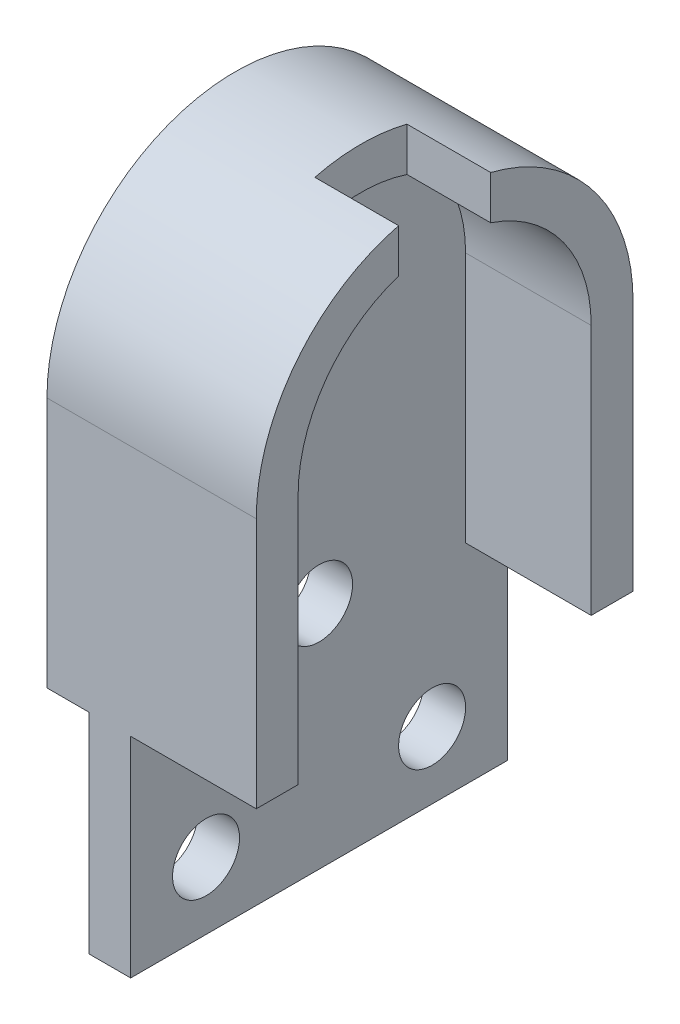
ISO-10303-21;
HEADER;
FILE_DESCRIPTION(('STEP AP214'),'2;1');
FILE_NAME('part.step','',(''),(''),'','','');
FILE_SCHEMA(('AUTOMOTIVE_DESIGN { 1 0 10303 214 1 1 1 1 }'));
ENDSEC;
DATA;
#1=APPLICATION_CONTEXT('core data for automotive mechanical design processes');
#2=APPLICATION_PROTOCOL_DEFINITION('international standard','automotive_design',2000,#1);
#3=PRODUCT_CONTEXT('',#1,'mechanical');
#4=PRODUCT('Part','Part','',(#3));
#5=PRODUCT_RELATED_PRODUCT_CATEGORY('part','',(#4));
#6=PRODUCT_DEFINITION_FORMATION('','',#4);
#7=PRODUCT_DEFINITION_CONTEXT('part definition',#1,'design');
#8=PRODUCT_DEFINITION('design','',#6,#7);
#9=PRODUCT_DEFINITION_SHAPE('','',#8);
#10=(LENGTH_UNIT() NAMED_UNIT(*) SI_UNIT(.MILLI.,.METRE.));
#11=(NAMED_UNIT(*) PLANE_ANGLE_UNIT() SI_UNIT($,.RADIAN.));
#12=(NAMED_UNIT(*) SI_UNIT($,.STERADIAN.) SOLID_ANGLE_UNIT());
#13=UNCERTAINTY_MEASURE_WITH_UNIT(LENGTH_MEASURE(1.E-05),#10,'distance_accuracy_value','');
#14=(GEOMETRIC_REPRESENTATION_CONTEXT(3) GLOBAL_UNCERTAINTY_ASSIGNED_CONTEXT((#13)) GLOBAL_UNIT_ASSIGNED_CONTEXT((#10,
#11,#12)) REPRESENTATION_CONTEXT('',''));
#15=CARTESIAN_POINT('',(0.,0.,0.));
#16=DIRECTION('',(0.,0.,1.));
#17=DIRECTION('',(1.,0.,0.));
#18=AXIS2_PLACEMENT_3D('',#15,#16,#17);
#19=CARTESIAN_POINT('',(20.,0.,0.));
#20=DIRECTION('',(1.,0.,0.));
#21=DIRECTION('',(0.,0.,-1.));
#22=AXIS2_PLACEMENT_3D('',#19,#20,#21);
#23=PLANE('',#22);
#24=DIRECTION('',(0.,1.,0.));
#25=VECTOR('',#24,1.);
#26=CARTESIAN_POINT('',(20.,0.,-5.5));
#27=LINE('',#26,#25);
#28=CARTESIAN_POINT('',(20.,44.1132477258361,-5.5));
#29=VERTEX_POINT('',#28);
#30=CARTESIAN_POINT('',(20.,49.3174242292714,-5.5));
#31=VERTEX_POINT('',#30);
#32=EDGE_CURVE('E43',#29,#31,#27,.T.);
#33=ORIENTED_EDGE('',*,*,#32,.F.);
#34=CARTESIAN_POINT('',(20.,27.5,0.));
#35=DIRECTION('',(1.,0.,0.));
#36=DIRECTION('',(0.,0.,-1.));
#37=AXIS2_PLACEMENT_3D('',#34,#35,#36);
#38=CIRCLE('',#37,17.5);
#39=CARTESIAN_POINT('',(20.,27.5,-17.5));
#40=VERTEX_POINT('',#39);
#41=EDGE_CURVE('E194',#40,#29,#38,.T.);
#42=ORIENTED_EDGE('',*,*,#41,.F.);
#43=DIRECTION('',(0.,-1.,0.));
#44=VECTOR('',#43,1.);
#45=CARTESIAN_POINT('',(20.,0.,-17.5));
#46=LINE('',#45,#44);
#47=CARTESIAN_POINT('',(20.,-2.50000000000001,-17.5));
#48=VERTEX_POINT('',#47);
#49=EDGE_CURVE('E197',#40,#48,#46,.T.);
#50=ORIENTED_EDGE('',*,*,#49,.T.);
#51=DIRECTION('',(0.,0.,-1.));
#52=VECTOR('',#51,1.);
#53=CARTESIAN_POINT('',(20.,-2.50000000000001,0.));
#54=LINE('',#53,#52);
#55=CARTESIAN_POINT('',(20.,-2.50000000000001,-22.5));
#56=VERTEX_POINT('',#55);
#57=EDGE_CURVE('E206',#48,#56,#54,.T.);
#58=ORIENTED_EDGE('',*,*,#57,.T.);
#59=DIRECTION('',(0.,1.,0.));
#60=VECTOR('',#59,1.);
#61=CARTESIAN_POINT('',(20.,0.,-22.5));
#62=LINE('',#61,#60);
#63=CARTESIAN_POINT('',(20.,27.5,-22.5));
#64=VERTEX_POINT('',#63);
#65=EDGE_CURVE('E209',#56,#64,#62,.T.);
#66=ORIENTED_EDGE('',*,*,#65,.T.);
#67=CARTESIAN_POINT('',(20.,27.5,0.));
#68=DIRECTION('',(1.,0.,0.));
#69=DIRECTION('',(0.,0.,-1.));
#70=AXIS2_PLACEMENT_3D('',#67,#68,#69);
#71=CIRCLE('',#70,22.5);
#72=EDGE_CURVE('E213',#64,#31,#71,.T.);
#73=ORIENTED_EDGE('',*,*,#72,.T.);
#74=EDGE_LOOP('',(#33,#42,#50,#58,#66,#73));
#75=FACE_BOUND('',#74,.T.);
#76=ADVANCED_FACE('F35',(#75),#23,.T.);
#77=CARTESIAN_POINT('',(5.,0.,0.));
#78=DIRECTION('',(1.,0.,0.));
#79=DIRECTION('',(0.,0.,-1.));
#80=AXIS2_PLACEMENT_3D('',#77,#78,#79);
#81=PLANE('',#80);
#82=CARTESIAN_POINT('',(5.,0.,0.));
#83=DIRECTION('',(1.,0.,0.));
#84=DIRECTION('',(0.,0.,-1.));
#85=AXIS2_PLACEMENT_3D('',#82,#83,#84);
#86=CIRCLE('',#85,4.);
#87=CARTESIAN_POINT('',(5.,0.,-4.));
#88=VERTEX_POINT('',#87);
#89=EDGE_CURVE('E319',#88,#88,#86,.T.);
#90=ORIENTED_EDGE('',*,*,#89,.F.);
#91=EDGE_LOOP('',(#90));
#92=FACE_BOUND('',#91,.T.);
#93=CARTESIAN_POINT('',(5.,-19.5,-13.5));
#94=DIRECTION('',(1.,0.,0.));
#95=DIRECTION('',(0.,0.,-1.));
#96=AXIS2_PLACEMENT_3D('',#93,#94,#95);
#97=CIRCLE('',#96,4.);
#98=CARTESIAN_POINT('',(5.,-19.5,-17.5));
#99=VERTEX_POINT('',#98);
#100=EDGE_CURVE('E316',#99,#99,#97,.T.);
#101=ORIENTED_EDGE('',*,*,#100,.F.);
#102=EDGE_LOOP('',(#101));
#103=FACE_BOUND('',#102,.T.);
#104=CARTESIAN_POINT('',(5.,-19.5,13.5));
#105=DIRECTION('',(1.,0.,0.));
#106=DIRECTION('',(0.,0.,-1.));
#107=AXIS2_PLACEMENT_3D('',#104,#105,#106);
#108=CIRCLE('',#107,4.);
#109=CARTESIAN_POINT('',(5.,-19.5,9.5));
#110=VERTEX_POINT('',#109);
#111=EDGE_CURVE('E199',#110,#110,#108,.T.);
#112=ORIENTED_EDGE('',*,*,#111,.F.);
#113=EDGE_LOOP('',(#112));
#114=FACE_BOUND('',#113,.T.);
#115=DIRECTION('',(0.,-1.,0.));
#116=VECTOR('',#115,1.);
#117=CARTESIAN_POINT('',(5.,0.,17.5));
#118=LINE('',#117,#116);
#119=CARTESIAN_POINT('',(5.,27.5,17.5));
#120=VERTEX_POINT('',#119);
#121=CARTESIAN_POINT('',(5.,-2.50000000000001,17.5));
#122=VERTEX_POINT('',#121);
#123=EDGE_CURVE('E58',#120,#122,#118,.T.);
#124=ORIENTED_EDGE('',*,*,#123,.T.);
#125=DIRECTION('',(0.,0.,1.));
#126=VECTOR('',#125,1.);
#127=CARTESIAN_POINT('',(5.,-2.50000000000001,0.));
#128=LINE('',#127,#126);
#129=CARTESIAN_POINT('',(5.,-2.50000000000001,22.5));
#130=VERTEX_POINT('',#129);
#131=EDGE_CURVE('E273',#122,#130,#128,.T.);
#132=ORIENTED_EDGE('',*,*,#131,.T.);
#133=DIRECTION('',(0.,1.,0.));
#134=VECTOR('',#133,1.);
#135=CARTESIAN_POINT('',(5.,0.,22.5));
#136=LINE('',#135,#134);
#137=CARTESIAN_POINT('',(5.,-27.5,22.5));
#138=VERTEX_POINT('',#137);
#139=EDGE_CURVE('E281',#138,#130,#136,.T.);
#140=ORIENTED_EDGE('',*,*,#139,.F.);
#141=DIRECTION('',(0.,0.,-1.));
#142=VECTOR('',#141,1.);
#143=CARTESIAN_POINT('',(5.,-27.5,0.));
#144=LINE('',#143,#142);
#145=CARTESIAN_POINT('',(5.,-27.5,-22.5));
#146=VERTEX_POINT('',#145);
#147=EDGE_CURVE('E285',#138,#146,#144,.T.);
#148=ORIENTED_EDGE('',*,*,#147,.T.);
#149=DIRECTION('',(0.,1.,0.));
#150=VECTOR('',#149,1.);
#151=CARTESIAN_POINT('',(5.,0.,-22.5));
#152=LINE('',#151,#150);
#153=CARTESIAN_POINT('',(5.,-2.50000000000001,-22.5));
#154=VERTEX_POINT('',#153);
#155=EDGE_CURVE('E279',#146,#154,#152,.T.);
#156=ORIENTED_EDGE('',*,*,#155,.T.);
#157=DIRECTION('',(0.,0.,-1.));
#158=VECTOR('',#157,1.);
#159=CARTESIAN_POINT('',(5.,-2.50000000000001,0.));
#160=LINE('',#159,#158);
#161=CARTESIAN_POINT('',(5.,-2.50000000000001,-17.5));
#162=VERTEX_POINT('',#161);
#163=EDGE_CURVE('E270',#162,#154,#160,.T.);
#164=ORIENTED_EDGE('',*,*,#163,.F.);
#165=DIRECTION('',(0.,-1.,0.));
#166=VECTOR('',#165,1.);
#167=CARTESIAN_POINT('',(5.,0.,-17.5));
#168=LINE('',#167,#166);
#169=CARTESIAN_POINT('',(5.,27.5,-17.5));
#170=VERTEX_POINT('',#169);
#171=EDGE_CURVE('E249',#170,#162,#168,.T.);
#172=ORIENTED_EDGE('',*,*,#171,.F.);
#173=CARTESIAN_POINT('',(5.,27.5,0.));
#174=DIRECTION('',(1.,0.,0.));
#175=DIRECTION('',(0.,0.,-1.));
#176=AXIS2_PLACEMENT_3D('',#173,#174,#175);
#177=CIRCLE('',#176,17.5);
#178=EDGE_CURVE('E276',#170,#120,#177,.T.);
#179=ORIENTED_EDGE('',*,*,#178,.T.);
#180=EDGE_LOOP('',(#124,#132,#140,#148,#156,#164,#172,#179));
#181=FACE_BOUND('',#180,.T.);
#182=ADVANCED_FACE('F377',(#92,#103,#114,#181),#81,.T.);
#183=CARTESIAN_POINT('',(0.,0.,0.));
#184=DIRECTION('',(1.,0.,0.));
#185=DIRECTION('',(0.,0.,-1.));
#186=AXIS2_PLACEMENT_3D('',#183,#184,#185);
#187=PLANE('',#186);
#188=CARTESIAN_POINT('',(0.,0.,0.));
#189=DIRECTION('',(1.,0.,0.));
#190=DIRECTION('',(0.,0.,-1.));
#191=AXIS2_PLACEMENT_3D('',#188,#189,#190);
#192=CIRCLE('',#191,4.);
#193=CARTESIAN_POINT('',(0.,0.,-4.));
#194=VERTEX_POINT('',#193);
#195=EDGE_CURVE('E317',#194,#194,#192,.T.);
#196=ORIENTED_EDGE('',*,*,#195,.T.);
#197=EDGE_LOOP('',(#196));
#198=FACE_BOUND('',#197,.T.);
#199=CARTESIAN_POINT('',(0.,-19.5,-13.5));
#200=DIRECTION('',(1.,0.,0.));
#201=DIRECTION('',(0.,0.,-1.));
#202=AXIS2_PLACEMENT_3D('',#199,#200,#201);
#203=CIRCLE('',#202,4.);
#204=CARTESIAN_POINT('',(0.,-19.5,-17.5));
#205=VERTEX_POINT('',#204);
#206=EDGE_CURVE('E313',#205,#205,#203,.T.);
#207=ORIENTED_EDGE('',*,*,#206,.T.);
#208=EDGE_LOOP('',(#207));
#209=FACE_BOUND('',#208,.T.);
#210=CARTESIAN_POINT('',(0.,-19.5,13.5));
#211=DIRECTION('',(1.,0.,0.));
#212=DIRECTION('',(0.,0.,-1.));
#213=AXIS2_PLACEMENT_3D('',#210,#211,#212);
#214=CIRCLE('',#213,4.);
#215=CARTESIAN_POINT('',(0.,-19.5,9.5));
#216=VERTEX_POINT('',#215);
#217=EDGE_CURVE('E195',#216,#216,#214,.T.);
#218=ORIENTED_EDGE('',*,*,#217,.T.);
#219=EDGE_LOOP('',(#218));
#220=FACE_BOUND('',#219,.T.);
#221=DIRECTION('',(0.,0.,1.));
#222=VECTOR('',#221,1.);
#223=CARTESIAN_POINT('',(0.,-2.50000000000001,0.));
#224=LINE('',#223,#222);
#225=CARTESIAN_POINT('',(0.,-2.50000000000001,17.5));
#226=VERTEX_POINT('',#225);
#227=CARTESIAN_POINT('',(0.,-2.50000000000001,22.5));
#228=VERTEX_POINT('',#227);
#229=EDGE_CURVE('E178',#226,#228,#224,.T.);
#230=ORIENTED_EDGE('',*,*,#229,.F.);
#231=DIRECTION('',(0.,-1.,0.));
#232=VECTOR('',#231,1.);
#233=CARTESIAN_POINT('',(0.,0.,17.5));
#234=LINE('',#233,#232);
#235=CARTESIAN_POINT('',(0.,27.5,17.5));
#236=VERTEX_POINT('',#235);
#237=EDGE_CURVE('E310',#236,#226,#234,.T.);
#238=ORIENTED_EDGE('',*,*,#237,.F.);
#239=CARTESIAN_POINT('',(0.,27.5,0.));
#240=DIRECTION('',(1.,0.,0.));
#241=DIRECTION('',(0.,0.,-1.));
#242=AXIS2_PLACEMENT_3D('',#239,#240,#241);
#243=CIRCLE('',#242,17.5);
#244=CARTESIAN_POINT('',(0.,27.5,-17.5));
#245=VERTEX_POINT('',#244);
#246=EDGE_CURVE('E308',#245,#236,#243,.T.);
#247=ORIENTED_EDGE('',*,*,#246,.F.);
#248=DIRECTION('',(0.,-1.,0.));
#249=VECTOR('',#248,1.);
#250=CARTESIAN_POINT('',(0.,0.,-17.5));
#251=LINE('',#250,#249);
#252=CARTESIAN_POINT('',(0.,-2.50000000000001,-17.5));
#253=VERTEX_POINT('',#252);
#254=EDGE_CURVE('E302',#245,#253,#251,.T.);
#255=ORIENTED_EDGE('',*,*,#254,.T.);
#256=DIRECTION('',(0.,0.,-1.));
#257=VECTOR('',#256,1.);
#258=CARTESIAN_POINT('',(0.,-2.50000000000001,0.));
#259=LINE('',#258,#257);
#260=CARTESIAN_POINT('',(0.,-2.50000000000001,-22.5));
#261=VERTEX_POINT('',#260);
#262=EDGE_CURVE('E305',#253,#261,#259,.T.);
#263=ORIENTED_EDGE('',*,*,#262,.T.);
#264=DIRECTION('',(0.,1.,0.));
#265=VECTOR('',#264,1.);
#266=CARTESIAN_POINT('',(0.,0.,-22.5));
#267=LINE('',#266,#265);
#268=CARTESIAN_POINT('',(0.,-27.5,-22.5));
#269=VERTEX_POINT('',#268);
#270=EDGE_CURVE('E278',#269,#261,#267,.T.);
#271=ORIENTED_EDGE('',*,*,#270,.F.);
#272=DIRECTION('',(0.,0.,-1.));
#273=VECTOR('',#272,1.);
#274=CARTESIAN_POINT('',(0.,-27.5,0.));
#275=LINE('',#274,#273);
#276=CARTESIAN_POINT('',(0.,-27.5,22.5));
#277=VERTEX_POINT('',#276);
#278=EDGE_CURVE('E282',#277,#269,#275,.T.);
#279=ORIENTED_EDGE('',*,*,#278,.F.);
#280=DIRECTION('',(0.,1.,0.));
#281=VECTOR('',#280,1.);
#282=CARTESIAN_POINT('',(0.,0.,22.5));
#283=LINE('',#282,#281);
#284=EDGE_CURVE('E290',#277,#228,#283,.T.);
#285=ORIENTED_EDGE('',*,*,#284,.T.);
#286=EDGE_LOOP('',(#230,#238,#247,#255,#263,#271,#279,#285));
#287=FACE_BOUND('',#286,.T.);
#288=ADVANCED_FACE('F380',(#198,#209,#220,#287),#187,.F.);
#289=CARTESIAN_POINT('',(5.,0.,-22.5));
#290=DIRECTION('',(0.,0.,1.));
#291=DIRECTION('',(1.,0.,0.));
#292=AXIS2_PLACEMENT_3D('',#289,#290,#291);
#293=PLANE('',#292);
#294=ORIENTED_EDGE('',*,*,#270,.T.);
#295=DIRECTION('',(1.,0.,0.));
#296=VECTOR('',#295,1.);
#297=CARTESIAN_POINT('',(-5.,-2.50000000000001,-22.5));
#298=LINE('',#297,#296);
#299=CARTESIAN_POINT('',(-5.,-2.50000000000001,-22.5));
#300=VERTEX_POINT('',#299);
#301=EDGE_CURVE('E259',#300,#261,#298,.T.);
#302=ORIENTED_EDGE('',*,*,#301,.F.);
#303=DIRECTION('',(0.,1.,0.));
#304=VECTOR('',#303,1.);
#305=CARTESIAN_POINT('',(-5.,0.,-22.5));
#306=LINE('',#305,#304);
#307=CARTESIAN_POINT('',(-5.,27.5,-22.5));
#308=VERTEX_POINT('',#307);
#309=EDGE_CURVE('E232',#300,#308,#306,.T.);
#310=ORIENTED_EDGE('',*,*,#309,.T.);
#311=DIRECTION('',(-1.,0.,0.));
#312=VECTOR('',#311,1.);
#313=CARTESIAN_POINT('',(5.,27.5,-22.5));
#314=LINE('',#313,#312);
#315=EDGE_CURVE('E300',#64,#308,#314,.T.);
#316=ORIENTED_EDGE('',*,*,#315,.F.);
#317=ORIENTED_EDGE('',*,*,#65,.F.);
#318=EDGE_CURVE('E261',#154,#56,#298,.T.);
#319=ORIENTED_EDGE('',*,*,#318,.F.);
#320=ORIENTED_EDGE('',*,*,#155,.F.);
#321=DIRECTION('',(-1.,0.,0.));
#322=VECTOR('',#321,1.);
#323=CARTESIAN_POINT('',(5.,-27.5,-22.5));
#324=LINE('',#323,#322);
#325=EDGE_CURVE('E287',#146,#269,#324,.T.);
#326=ORIENTED_EDGE('',*,*,#325,.T.);
#327=EDGE_LOOP('',(#294,#302,#310,#316,#317,#319,#320,#326));
#328=FACE_BOUND('',#327,.T.);
#329=ADVANCED_FACE('F37',(#328),#293,.F.);
#330=CARTESIAN_POINT('',(5.,27.5,0.));
#331=DIRECTION('',(-1.,0.,0.));
#332=DIRECTION('',(0.,0.,1.));
#333=AXIS2_PLACEMENT_3D('',#330,#331,#332);
#334=CYLINDRICAL_SURFACE('',#333,22.5);
#335=CARTESIAN_POINT('',(10.,27.5,0.));
#336=DIRECTION('',(-1.,0.,0.));
#337=DIRECTION('',(0.,0.,1.));
#338=AXIS2_PLACEMENT_3D('',#335,#336,#337);
#339=CIRCLE('',#338,22.5);
#340=CARTESIAN_POINT('',(10.,49.3174242292714,5.5));
#341=VERTEX_POINT('',#340);
#342=CARTESIAN_POINT('',(10.,49.3174242292714,-5.5));
#343=VERTEX_POINT('',#342);
#344=EDGE_CURVE('E334',#341,#343,#339,.T.);
#345=ORIENTED_EDGE('',*,*,#344,.T.);
#346=DIRECTION('',(-1.,0.,0.));
#347=VECTOR('',#346,1.);
#348=CARTESIAN_POINT('',(5.,49.3174242292714,-5.5));
#349=LINE('',#348,#347);
#350=EDGE_CURVE('E325',#343,#31,#349,.F.);
#351=ORIENTED_EDGE('',*,*,#350,.T.);
#352=ORIENTED_EDGE('',*,*,#72,.F.);
#353=ORIENTED_EDGE('',*,*,#315,.T.);
#354=CARTESIAN_POINT('',(-5.,27.5,0.));
#355=DIRECTION('',(1.,0.,0.));
#356=DIRECTION('',(0.,0.,-1.));
#357=AXIS2_PLACEMENT_3D('',#354,#355,#356);
#358=CIRCLE('',#357,22.5);
#359=CARTESIAN_POINT('',(-5.,27.5,22.5));
#360=VERTEX_POINT('',#359);
#361=EDGE_CURVE('E235',#308,#360,#358,.T.);
#362=ORIENTED_EDGE('',*,*,#361,.T.);
#363=DIRECTION('',(-1.,0.,0.));
#364=VECTOR('',#363,1.);
#365=CARTESIAN_POINT('',(5.,27.5,22.5));
#366=LINE('',#365,#364);
#367=CARTESIAN_POINT('',(20.,27.5,22.5));
#368=VERTEX_POINT('',#367);
#369=EDGE_CURVE('E298',#368,#360,#366,.T.);
#370=ORIENTED_EDGE('',*,*,#369,.F.);
#371=CARTESIAN_POINT('',(20.,49.3174242292714,5.5));
#372=VERTEX_POINT('',#371);
#373=EDGE_CURVE('E212',#372,#368,#71,.T.);
#374=ORIENTED_EDGE('',*,*,#373,.F.);
#375=DIRECTION('',(-1.,0.,0.));
#376=VECTOR('',#375,1.);
#377=CARTESIAN_POINT('',(5.,49.3174242292714,5.5));
#378=LINE('',#377,#376);
#379=EDGE_CURVE('E50',#372,#341,#378,.T.);
#380=ORIENTED_EDGE('',*,*,#379,.T.);
#381=EDGE_LOOP('',(#345,#351,#352,#353,#362,#370,#374,#380));
#382=FACE_BOUND('',#381,.T.);
#383=ADVANCED_FACE('F333',(#382),#334,.T.);
#384=CARTESIAN_POINT('',(5.,0.,22.5));
#385=DIRECTION('',(0.,0.,1.));
#386=DIRECTION('',(1.,0.,0.));
#387=AXIS2_PLACEMENT_3D('',#384,#385,#386);
#388=PLANE('',#387);
#389=DIRECTION('',(1.,0.,0.));
#390=VECTOR('',#389,1.);
#391=CARTESIAN_POINT('',(-5.,-2.50000000000001,22.5));
#392=LINE('',#391,#390);
#393=CARTESIAN_POINT('',(-5.,-2.50000000000001,22.5));
#394=VERTEX_POINT('',#393);
#395=EDGE_CURVE('E255',#394,#228,#392,.T.);
#396=ORIENTED_EDGE('',*,*,#395,.T.);
#397=ORIENTED_EDGE('',*,*,#284,.F.);
#398=DIRECTION('',(-1.,0.,0.));
#399=VECTOR('',#398,1.);
#400=CARTESIAN_POINT('',(5.,-27.5,22.5));
#401=LINE('',#400,#399);
#402=EDGE_CURVE('E296',#138,#277,#401,.T.);
#403=ORIENTED_EDGE('',*,*,#402,.F.);
#404=ORIENTED_EDGE('',*,*,#139,.T.);
#405=CARTESIAN_POINT('',(20.,-2.50000000000001,22.5));
#406=VERTEX_POINT('',#405);
#407=EDGE_CURVE('E258',#130,#406,#392,.T.);
#408=ORIENTED_EDGE('',*,*,#407,.T.);
#409=DIRECTION('',(0.,1.,0.));
#410=VECTOR('',#409,1.);
#411=CARTESIAN_POINT('',(20.,0.,22.5));
#412=LINE('',#411,#410);
#413=EDGE_CURVE('E216',#406,#368,#412,.T.);
#414=ORIENTED_EDGE('',*,*,#413,.T.);
#415=ORIENTED_EDGE('',*,*,#369,.T.);
#416=DIRECTION('',(0.,1.,0.));
#417=VECTOR('',#416,1.);
#418=CARTESIAN_POINT('',(-5.,0.,22.5));
#419=LINE('',#418,#417);
#420=EDGE_CURVE('E238',#394,#360,#419,.T.);
#421=ORIENTED_EDGE('',*,*,#420,.F.);
#422=EDGE_LOOP('',(#396,#397,#403,#404,#408,#414,#415,#421));
#423=FACE_BOUND('',#422,.T.);
#424=ADVANCED_FACE('F351',(#423),#388,.T.);
#425=CARTESIAN_POINT('',(5.,-27.5,0.));
#426=DIRECTION('',(0.,1.,0.));
#427=DIRECTION('',(0.,0.,1.));
#428=AXIS2_PLACEMENT_3D('',#425,#426,#427);
#429=PLANE('',#428);
#430=ORIENTED_EDGE('',*,*,#278,.T.);
#431=ORIENTED_EDGE('',*,*,#325,.F.);
#432=ORIENTED_EDGE('',*,*,#147,.F.);
#433=ORIENTED_EDGE('',*,*,#402,.T.);
#434=EDGE_LOOP('',(#430,#431,#432,#433));
#435=FACE_BOUND('',#434,.T.);
#436=ADVANCED_FACE('F420',(#435),#429,.F.);
#437=CARTESIAN_POINT('',(-5.,0.,0.));
#438=DIRECTION('',(1.,0.,0.));
#439=DIRECTION('',(0.,0.,-1.));
#440=AXIS2_PLACEMENT_3D('',#437,#438,#439);
#441=PLANE('',#440);
#442=CARTESIAN_POINT('',(-5.,27.5,0.));
#443=DIRECTION('',(1.,0.,0.));
#444=DIRECTION('',(0.,0.,-1.));
#445=AXIS2_PLACEMENT_3D('',#442,#443,#444);
#446=CIRCLE('',#445,17.5);
#447=CARTESIAN_POINT('',(-5.,27.5,-17.5));
#448=VERTEX_POINT('',#447);
#449=CARTESIAN_POINT('',(-5.,27.5,17.5));
#450=VERTEX_POINT('',#449);
#451=EDGE_CURVE('E223',#448,#450,#446,.T.);
#452=ORIENTED_EDGE('',*,*,#451,.T.);
#453=DIRECTION('',(0.,-1.,0.));
#454=VECTOR('',#453,1.);
#455=CARTESIAN_POINT('',(-5.,0.,17.5));
#456=LINE('',#455,#454);
#457=CARTESIAN_POINT('',(-5.,-2.50000000000001,17.5));
#458=VERTEX_POINT('',#457);
#459=EDGE_CURVE('E243',#450,#458,#456,.T.);
#460=ORIENTED_EDGE('',*,*,#459,.T.);
#461=DIRECTION('',(0.,0.,1.));
#462=VECTOR('',#461,1.);
#463=CARTESIAN_POINT('',(-5.,-2.50000000000001,0.));
#464=LINE('',#463,#462);
#465=EDGE_CURVE('E241',#458,#394,#464,.T.);
#466=ORIENTED_EDGE('',*,*,#465,.T.);
#467=ORIENTED_EDGE('',*,*,#420,.T.);
#468=ORIENTED_EDGE('',*,*,#361,.F.);
#469=ORIENTED_EDGE('',*,*,#309,.F.);
#470=DIRECTION('',(0.,0.,-1.));
#471=VECTOR('',#470,1.);
#472=CARTESIAN_POINT('',(-5.,-2.50000000000001,0.));
#473=LINE('',#472,#471);
#474=CARTESIAN_POINT('',(-5.,-2.50000000000001,-17.5));
#475=VERTEX_POINT('',#474);
#476=EDGE_CURVE('E229',#475,#300,#473,.T.);
#477=ORIENTED_EDGE('',*,*,#476,.F.);
#478=DIRECTION('',(0.,-1.,0.));
#479=VECTOR('',#478,1.);
#480=CARTESIAN_POINT('',(-5.,0.,-17.5));
#481=LINE('',#480,#479);
#482=EDGE_CURVE('E226',#448,#475,#481,.T.);
#483=ORIENTED_EDGE('',*,*,#482,.F.);
#484=EDGE_LOOP('',(#452,#460,#466,#467,#468,#469,#477,#483));
#485=FACE_BOUND('',#484,.T.);
#486=ADVANCED_FACE('F345',(#485),#441,.F.);
#487=CARTESIAN_POINT('',(-5.,0.,-17.5));
#488=DIRECTION('',(0.,0.,1.));
#489=DIRECTION('',(0.,-1.,0.));
#490=AXIS2_PLACEMENT_3D('',#487,#488,#489);
#491=PLANE('',#490);
#492=ORIENTED_EDGE('',*,*,#254,.F.);
#493=DIRECTION('',(1.,0.,0.));
#494=VECTOR('',#493,1.);
#495=CARTESIAN_POINT('',(-5.,27.5,-17.5));
#496=LINE('',#495,#494);
#497=EDGE_CURVE('E265',#448,#245,#496,.T.);
#498=ORIENTED_EDGE('',*,*,#497,.F.);
#499=ORIENTED_EDGE('',*,*,#482,.T.);
#500=DIRECTION('',(1.,0.,0.));
#501=VECTOR('',#500,1.);
#502=CARTESIAN_POINT('',(-5.,-2.50000000000001,-17.5));
#503=LINE('',#502,#501);
#504=EDGE_CURVE('E262',#475,#253,#503,.T.);
#505=ORIENTED_EDGE('',*,*,#504,.T.);
#506=EDGE_LOOP('',(#492,#498,#499,#505));
#507=FACE_BOUND('',#506,.T.);
#508=ADVANCED_FACE('F413',(#507),#491,.T.);
#509=CARTESIAN_POINT('',(-5.,-2.50000000000001,0.));
#510=DIRECTION('',(0.,-1.,0.));
#511=DIRECTION('',(0.,0.,-1.));
#512=AXIS2_PLACEMENT_3D('',#509,#510,#511);
#513=PLANE('',#512);
#514=ORIENTED_EDGE('',*,*,#262,.F.);
#515=ORIENTED_EDGE('',*,*,#504,.F.);
#516=ORIENTED_EDGE('',*,*,#476,.T.);
#517=ORIENTED_EDGE('',*,*,#301,.T.);
#518=EDGE_LOOP('',(#514,#515,#516,#517));
#519=FACE_BOUND('',#518,.T.);
#520=ADVANCED_FACE('F415',(#519),#513,.T.);
#521=CARTESIAN_POINT('',(-5.,-2.50000000000001,0.));
#522=DIRECTION('',(0.,1.,0.));
#523=DIRECTION('',(0.,0.,1.));
#524=AXIS2_PLACEMENT_3D('',#521,#522,#523);
#525=PLANE('',#524);
#526=DIRECTION('',(1.,0.,0.));
#527=VECTOR('',#526,1.);
#528=CARTESIAN_POINT('',(-5.,-2.50000000000001,17.5));
#529=LINE('',#528,#527);
#530=EDGE_CURVE('E251',#458,#226,#529,.T.);
#531=ORIENTED_EDGE('',*,*,#530,.T.);
#532=ORIENTED_EDGE('',*,*,#229,.T.);
#533=ORIENTED_EDGE('',*,*,#395,.F.);
#534=ORIENTED_EDGE('',*,*,#465,.F.);
#535=EDGE_LOOP('',(#531,#532,#533,#534));
#536=FACE_BOUND('',#535,.T.);
#537=ADVANCED_FACE('F401',(#536),#525,.F.);
#538=CARTESIAN_POINT('',(-5.,0.,17.5));
#539=DIRECTION('',(0.,0.,1.));
#540=DIRECTION('',(0.,-1.,0.));
#541=AXIS2_PLACEMENT_3D('',#538,#539,#540);
#542=PLANE('',#541);
#543=DIRECTION('',(1.,0.,0.));
#544=VECTOR('',#543,1.);
#545=CARTESIAN_POINT('',(-5.,27.5,17.5));
#546=LINE('',#545,#544);
#547=EDGE_CURVE('E246',#450,#236,#546,.T.);
#548=ORIENTED_EDGE('',*,*,#547,.T.);
#549=ORIENTED_EDGE('',*,*,#237,.T.);
#550=ORIENTED_EDGE('',*,*,#530,.F.);
#551=ORIENTED_EDGE('',*,*,#459,.F.);
#552=EDGE_LOOP('',(#548,#549,#550,#551));
#553=FACE_BOUND('',#552,.T.);
#554=ADVANCED_FACE('F404',(#553),#542,.F.);
#555=CARTESIAN_POINT('',(-5.,27.5,0.));
#556=DIRECTION('',(1.,0.,0.));
#557=DIRECTION('',(0.,0.,-1.));
#558=AXIS2_PLACEMENT_3D('',#555,#556,#557);
#559=CYLINDRICAL_SURFACE('',#558,17.5);
#560=ORIENTED_EDGE('',*,*,#497,.T.);
#561=ORIENTED_EDGE('',*,*,#246,.T.);
#562=ORIENTED_EDGE('',*,*,#547,.F.);
#563=ORIENTED_EDGE('',*,*,#451,.F.);
#564=EDGE_LOOP('',(#560,#561,#562,#563));
#565=FACE_BOUND('',#564,.T.);
#566=ADVANCED_FACE('F408',(#565),#559,.F.);
#567=ORIENTED_EDGE('',*,*,#41,.T.);
#568=DIRECTION('',(1.,0.,0.));
#569=VECTOR('',#568,1.);
#570=CARTESIAN_POINT('',(-5.,44.1132477258361,-5.5));
#571=LINE('',#570,#569);
#572=CARTESIAN_POINT('',(10.,44.1132477258361,-5.5));
#573=VERTEX_POINT('',#572);
#574=EDGE_CURVE('E327',#29,#573,#571,.F.);
#575=ORIENTED_EDGE('',*,*,#574,.T.);
#576=CARTESIAN_POINT('',(10.,27.5,0.));
#577=DIRECTION('',(-1.,0.,0.));
#578=DIRECTION('',(0.,0.,1.));
#579=AXIS2_PLACEMENT_3D('',#576,#577,#578);
#580=CIRCLE('',#579,17.5);
#581=CARTESIAN_POINT('',(10.,44.1132477258361,5.5));
#582=VERTEX_POINT('',#581);
#583=EDGE_CURVE('E11',#573,#582,#580,.F.);
#584=ORIENTED_EDGE('',*,*,#583,.T.);
#585=DIRECTION('',(1.,0.,0.));
#586=VECTOR('',#585,1.);
#587=CARTESIAN_POINT('',(-5.,44.1132477258361,5.5));
#588=LINE('',#587,#586);
#589=CARTESIAN_POINT('',(20.,44.1132477258361,5.5));
#590=VERTEX_POINT('',#589);
#591=EDGE_CURVE('E173',#582,#590,#588,.T.);
#592=ORIENTED_EDGE('',*,*,#591,.T.);
#593=CARTESIAN_POINT('',(20.,27.5,17.5));
#594=VERTEX_POINT('',#593);
#595=EDGE_CURVE('E184',#590,#594,#38,.T.);
#596=ORIENTED_EDGE('',*,*,#595,.T.);
#597=EDGE_CURVE('E250',#120,#594,#546,.T.);
#598=ORIENTED_EDGE('',*,*,#597,.F.);
#599=ORIENTED_EDGE('',*,*,#178,.F.);
#600=EDGE_CURVE('E245',#170,#40,#496,.T.);
#601=ORIENTED_EDGE('',*,*,#600,.T.);
#602=EDGE_LOOP('',(#567,#575,#584,#592,#596,#598,#599,#601));
#603=FACE_BOUND('',#602,.T.);
#604=ADVANCED_FACE('F182',(#603),#559,.F.);
#605=ORIENTED_EDGE('',*,*,#123,.F.);
#606=ORIENTED_EDGE('',*,*,#597,.T.);
#607=DIRECTION('',(0.,-1.,0.));
#608=VECTOR('',#607,1.);
#609=CARTESIAN_POINT('',(20.,0.,17.5));
#610=LINE('',#609,#608);
#611=CARTESIAN_POINT('',(20.,-2.50000000000001,17.5));
#612=VERTEX_POINT('',#611);
#613=EDGE_CURVE('E193',#594,#612,#610,.T.);
#614=ORIENTED_EDGE('',*,*,#613,.T.);
#615=EDGE_CURVE('E254',#122,#612,#529,.T.);
#616=ORIENTED_EDGE('',*,*,#615,.F.);
#617=EDGE_LOOP('',(#605,#606,#614,#616));
#618=FACE_BOUND('',#617,.T.);
#619=ADVANCED_FACE('F359',(#618),#542,.F.);
#620=ORIENTED_EDGE('',*,*,#131,.F.);
#621=ORIENTED_EDGE('',*,*,#615,.T.);
#622=DIRECTION('',(0.,0.,1.));
#623=VECTOR('',#622,1.);
#624=CARTESIAN_POINT('',(20.,-2.50000000000001,0.));
#625=LINE('',#624,#623);
#626=EDGE_CURVE('E219',#612,#406,#625,.T.);
#627=ORIENTED_EDGE('',*,*,#626,.T.);
#628=ORIENTED_EDGE('',*,*,#407,.F.);
#629=EDGE_LOOP('',(#620,#621,#627,#628));
#630=FACE_BOUND('',#629,.T.);
#631=ADVANCED_FACE('F356',(#630),#525,.F.);
#632=EDGE_CURVE('E264',#162,#48,#503,.T.);
#633=ORIENTED_EDGE('',*,*,#632,.F.);
#634=ORIENTED_EDGE('',*,*,#163,.T.);
#635=ORIENTED_EDGE('',*,*,#318,.T.);
#636=ORIENTED_EDGE('',*,*,#57,.F.);
#637=EDGE_LOOP('',(#633,#634,#635,#636));
#638=FACE_BOUND('',#637,.T.);
#639=ADVANCED_FACE('F422',(#638),#513,.T.);
#640=ORIENTED_EDGE('',*,*,#600,.F.);
#641=ORIENTED_EDGE('',*,*,#171,.T.);
#642=ORIENTED_EDGE('',*,*,#632,.T.);
#643=ORIENTED_EDGE('',*,*,#49,.F.);
#644=EDGE_LOOP('',(#640,#641,#642,#643));
#645=FACE_BOUND('',#644,.T.);
#646=ADVANCED_FACE('F364',(#645),#491,.T.);
#647=DIRECTION('',(0.,-1.,0.));
#648=VECTOR('',#647,1.);
#649=CARTESIAN_POINT('',(20.,0.,5.5));
#650=LINE('',#649,#648);
#651=EDGE_CURVE('E170',#372,#590,#650,.T.);
#652=ORIENTED_EDGE('',*,*,#651,.F.);
#653=ORIENTED_EDGE('',*,*,#373,.T.);
#654=ORIENTED_EDGE('',*,*,#413,.F.);
#655=ORIENTED_EDGE('',*,*,#626,.F.);
#656=ORIENTED_EDGE('',*,*,#613,.F.);
#657=ORIENTED_EDGE('',*,*,#595,.F.);
#658=EDGE_LOOP('',(#652,#653,#654,#655,#656,#657));
#659=FACE_BOUND('',#658,.T.);
#660=ADVANCED_FACE('F190',(#659),#23,.T.);
#661=CARTESIAN_POINT('',(-5.,-19.5,13.5));
#662=DIRECTION('',(1.,0.,0.));
#663=DIRECTION('',(0.,0.,-1.));
#664=AXIS2_PLACEMENT_3D('',#661,#662,#663);
#665=CYLINDRICAL_SURFACE('',#664,4.);
#666=ORIENTED_EDGE('',*,*,#111,.T.);
#667=EDGE_LOOP('',(#666));
#668=FACE_BOUND('',#667,.T.);
#669=ORIENTED_EDGE('',*,*,#217,.F.);
#670=EDGE_LOOP('',(#669));
#671=FACE_BOUND('',#670,.T.);
#672=ADVANCED_FACE('F386',(#668,#671),#665,.F.);
#673=CARTESIAN_POINT('',(-5.,-19.5,-13.5));
#674=DIRECTION('',(1.,0.,0.));
#675=DIRECTION('',(0.,0.,-1.));
#676=AXIS2_PLACEMENT_3D('',#673,#674,#675);
#677=CYLINDRICAL_SURFACE('',#676,4.);
#678=ORIENTED_EDGE('',*,*,#100,.T.);
#679=EDGE_LOOP('',(#678));
#680=FACE_BOUND('',#679,.T.);
#681=ORIENTED_EDGE('',*,*,#206,.F.);
#682=EDGE_LOOP('',(#681));
#683=FACE_BOUND('',#682,.T.);
#684=ADVANCED_FACE('F374',(#680,#683),#677,.F.);
#685=CARTESIAN_POINT('',(-5.,0.,0.));
#686=DIRECTION('',(1.,0.,0.));
#687=DIRECTION('',(0.,0.,-1.));
#688=AXIS2_PLACEMENT_3D('',#685,#686,#687);
#689=CYLINDRICAL_SURFACE('',#688,4.);
#690=ORIENTED_EDGE('',*,*,#89,.T.);
#691=EDGE_LOOP('',(#690));
#692=FACE_BOUND('',#691,.T.);
#693=ORIENTED_EDGE('',*,*,#195,.F.);
#694=EDGE_LOOP('',(#693));
#695=FACE_BOUND('',#694,.T.);
#696=ADVANCED_FACE('F455',(#692,#695),#689,.F.);
#697=CARTESIAN_POINT('',(10.,0.,0.));
#698=DIRECTION('',(-1.,0.,0.));
#699=DIRECTION('',(0.,0.,1.));
#700=AXIS2_PLACEMENT_3D('',#697,#698,#699);
#701=PLANE('',#700);
#702=DIRECTION('',(0.,-1.,0.));
#703=VECTOR('',#702,1.);
#704=CARTESIAN_POINT('',(10.,40.,5.5));
#705=LINE('',#704,#703);
#706=EDGE_CURVE('E187',#341,#582,#705,.T.);
#707=ORIENTED_EDGE('',*,*,#706,.T.);
#708=ORIENTED_EDGE('',*,*,#583,.F.);
#709=DIRECTION('',(0.,1.,0.));
#710=VECTOR('',#709,1.);
#711=CARTESIAN_POINT('',(10.,40.,-5.5));
#712=LINE('',#711,#710);
#713=EDGE_CURVE('E658',#573,#343,#712,.T.);
#714=ORIENTED_EDGE('',*,*,#713,.T.);
#715=ORIENTED_EDGE('',*,*,#344,.F.);
#716=EDGE_LOOP('',(#707,#708,#714,#715));
#717=FACE_BOUND('',#716,.T.);
#718=ADVANCED_FACE('F462',(#717),#701,.F.);
#719=CARTESIAN_POINT('',(10.,40.,-5.5));
#720=DIRECTION('',(0.,0.,-1.));
#721=DIRECTION('',(-1.,0.,0.));
#722=AXIS2_PLACEMENT_3D('',#719,#720,#721);
#723=PLANE('',#722);
#724=ORIENTED_EDGE('',*,*,#713,.F.);
#725=ORIENTED_EDGE('',*,*,#574,.F.);
#726=ORIENTED_EDGE('',*,*,#32,.T.);
#727=ORIENTED_EDGE('',*,*,#350,.F.);
#728=EDGE_LOOP('',(#724,#725,#726,#727));
#729=FACE_BOUND('',#728,.T.);
#730=ADVANCED_FACE('F324',(#729),#723,.F.);
#731=CARTESIAN_POINT('',(10.,40.,5.5));
#732=DIRECTION('',(0.,0.,1.));
#733=DIRECTION('',(1.,0.,0.));
#734=AXIS2_PLACEMENT_3D('',#731,#732,#733);
#735=PLANE('',#734);
#736=ORIENTED_EDGE('',*,*,#651,.T.);
#737=ORIENTED_EDGE('',*,*,#591,.F.);
#738=ORIENTED_EDGE('',*,*,#706,.F.);
#739=ORIENTED_EDGE('',*,*,#379,.F.);
#740=EDGE_LOOP('',(#736,#737,#738,#739));
#741=FACE_BOUND('',#740,.T.);
#742=ADVANCED_FACE('F172',(#741),#735,.F.);
#743=CLOSED_SHELL('',(#76,#182,#288,#329,#383,#424,#436,#486,#508,#520,#537,#554,#566,#604,#619,
#631,#639,#646,#660,#672,#684,#696,#718,#730,#742));
#744=MANIFOLD_SOLID_BREP('B2',#743);
#745=ADVANCED_BREP_SHAPE_REPRESENTATION('',(#18,#744),#14);
#746=SHAPE_DEFINITION_REPRESENTATION(#9,#745);
ENDSEC;
END-ISO-10303-21;
